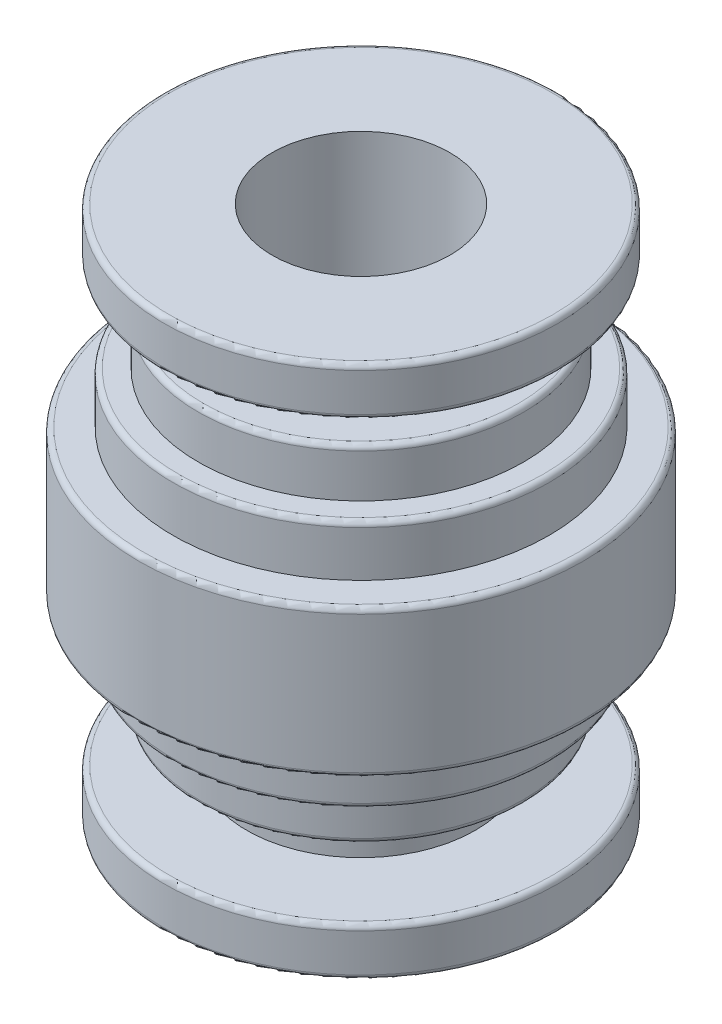
ISO-10303-21;
HEADER;
FILE_DESCRIPTION(('STEP AP214'),'2;1');
FILE_NAME('part.step','',(''),(''),'','','');
FILE_SCHEMA(('AUTOMOTIVE_DESIGN { 1 0 10303 214 1 1 1 1 }'));
ENDSEC;
DATA;
#1=APPLICATION_CONTEXT('core data for automotive mechanical design processes');
#2=APPLICATION_PROTOCOL_DEFINITION('international standard','automotive_design',2000,#1);
#3=PRODUCT_CONTEXT('',#1,'mechanical');
#4=PRODUCT('Part','Part','',(#3));
#5=PRODUCT_RELATED_PRODUCT_CATEGORY('part','',(#4));
#6=PRODUCT_DEFINITION_FORMATION('','',#4);
#7=PRODUCT_DEFINITION_CONTEXT('part definition',#1,'design');
#8=PRODUCT_DEFINITION('design','',#6,#7);
#9=PRODUCT_DEFINITION_SHAPE('','',#8);
#10=(LENGTH_UNIT() NAMED_UNIT(*) SI_UNIT(.MILLI.,.METRE.));
#11=(NAMED_UNIT(*) PLANE_ANGLE_UNIT() SI_UNIT($,.RADIAN.));
#12=(NAMED_UNIT(*) SI_UNIT($,.STERADIAN.) SOLID_ANGLE_UNIT());
#13=UNCERTAINTY_MEASURE_WITH_UNIT(LENGTH_MEASURE(1.E-05),#10,'distance_accuracy_value','');
#14=(GEOMETRIC_REPRESENTATION_CONTEXT(3) GLOBAL_UNCERTAINTY_ASSIGNED_CONTEXT((#13)) GLOBAL_UNIT_ASSIGNED_CONTEXT((#10,
#11,#12)) REPRESENTATION_CONTEXT('',''));
#15=CARTESIAN_POINT('',(0.,0.,0.));
#16=DIRECTION('',(0.,0.,1.));
#17=DIRECTION('',(1.,0.,0.));
#18=AXIS2_PLACEMENT_3D('',#15,#16,#17);
#19=CARTESIAN_POINT('',(0.,-10.3,0.));
#20=DIRECTION('',(0.,-1.,0.));
#21=DIRECTION('',(0.,0.,-1.));
#22=AXIS2_PLACEMENT_3D('',#19,#20,#21);
#23=TOROIDAL_SURFACE('',#22,7.55,0.2);
#24=CARTESIAN_POINT('',(0.,-10.3,0.));
#25=DIRECTION('',(0.,-1.,0.));
#26=DIRECTION('',(-1.,0.,0.));
#27=AXIS2_PLACEMENT_3D('',#24,#25,#26);
#28=CIRCLE('',#27,7.75);
#29=CARTESIAN_POINT('',(7.75,-10.3,0.));
#30=VERTEX_POINT('',#29);
#31=EDGE_CURVE('E10',#30,#30,#28,.T.);
#32=ORIENTED_EDGE('',*,*,#31,.T.);
#33=EDGE_LOOP('',(#32));
#34=FACE_BOUND('',#33,.T.);
#35=CARTESIAN_POINT('',(0.,-10.5,0.));
#36=DIRECTION('',(0.,1.,0.));
#37=DIRECTION('',(-1.,0.,0.));
#38=AXIS2_PLACEMENT_3D('',#35,#36,#37);
#39=CIRCLE('',#38,7.55);
#40=CARTESIAN_POINT('',(7.55,-10.5,0.));
#41=VERTEX_POINT('',#40);
#42=EDGE_CURVE('E27',#41,#41,#39,.T.);
#43=ORIENTED_EDGE('',*,*,#42,.T.);
#44=EDGE_LOOP('',(#43));
#45=FACE_BOUND('',#44,.T.);
#46=ADVANCED_FACE('F16',(#34,#45),#23,.T.);
#47=CARTESIAN_POINT('',(0.,-9.55,0.));
#48=DIRECTION('',(0.,-1.,0.));
#49=DIRECTION('',(1.,0.,0.));
#50=AXIS2_PLACEMENT_3D('',#47,#48,#49);
#51=CYLINDRICAL_SURFACE('',#50,7.75);
#52=CARTESIAN_POINT('',(0.,-8.8,0.));
#53=DIRECTION('',(0.,1.,0.));
#54=DIRECTION('',(-1.,0.,0.));
#55=AXIS2_PLACEMENT_3D('',#52,#53,#54);
#56=CIRCLE('',#55,7.75);
#57=CARTESIAN_POINT('',(7.75,-8.8,0.));
#58=VERTEX_POINT('',#57);
#59=EDGE_CURVE('E269',#58,#58,#56,.T.);
#60=ORIENTED_EDGE('',*,*,#59,.F.);
#61=EDGE_LOOP('',(#60));
#62=FACE_BOUND('',#61,.T.);
#63=ORIENTED_EDGE('',*,*,#31,.F.);
#64=EDGE_LOOP('',(#63));
#65=FACE_BOUND('',#64,.T.);
#66=ADVANCED_FACE('F321',(#62,#65),#51,.T.);
#67=CARTESIAN_POINT('',(7.75,-10.5,0.));
#68=DIRECTION('',(0.,1.,0.));
#69=DIRECTION('',(1.,0.,0.));
#70=AXIS2_PLACEMENT_3D('',#67,#68,#69);
#71=PLANE('',#70);
#72=ORIENTED_EDGE('',*,*,#42,.F.);
#73=EDGE_LOOP('',(#72));
#74=FACE_BOUND('',#73,.T.);
#75=CARTESIAN_POINT('',(0.,-10.5,0.));
#76=DIRECTION('',(0.,-1.,0.));
#77=DIRECTION('',(1.,0.,0.));
#78=AXIS2_PLACEMENT_3D('',#75,#76,#77);
#79=CIRCLE('',#78,3.5);
#80=CARTESIAN_POINT('',(3.5,-10.5,0.));
#81=VERTEX_POINT('',#80);
#82=EDGE_CURVE('E20',#81,#81,#79,.T.);
#83=ORIENTED_EDGE('',*,*,#82,.F.);
#84=EDGE_LOOP('',(#83));
#85=FACE_BOUND('',#84,.T.);
#86=ADVANCED_FACE('F188',(#74,#85),#71,.F.);
#87=CARTESIAN_POINT('',(0.,-8.8,0.));
#88=DIRECTION('',(0.,-1.,0.));
#89=DIRECTION('',(0.,0.,-1.));
#90=AXIS2_PLACEMENT_3D('',#87,#88,#89);
#91=TOROIDAL_SURFACE('',#90,7.55,0.2);
#92=CARTESIAN_POINT('',(0.,-8.6,0.));
#93=DIRECTION('',(0.,-1.,0.));
#94=DIRECTION('',(-1.,0.,0.));
#95=AXIS2_PLACEMENT_3D('',#92,#93,#94);
#96=CIRCLE('',#95,7.55);
#97=CARTESIAN_POINT('',(7.55,-8.6,0.));
#98=VERTEX_POINT('',#97);
#99=EDGE_CURVE('E229',#98,#98,#96,.T.);
#100=ORIENTED_EDGE('',*,*,#99,.T.);
#101=EDGE_LOOP('',(#100));
#102=FACE_BOUND('',#101,.T.);
#103=ORIENTED_EDGE('',*,*,#59,.T.);
#104=EDGE_LOOP('',(#103));
#105=FACE_BOUND('',#104,.T.);
#106=ADVANCED_FACE('F547',(#102,#105),#91,.T.);
#107=CARTESIAN_POINT('',(4.5,-8.6,0.));
#108=DIRECTION('',(0.,-1.,0.));
#109=DIRECTION('',(0.,0.,-1.));
#110=AXIS2_PLACEMENT_3D('',#107,#108,#109);
#111=PLANE('',#110);
#112=ORIENTED_EDGE('',*,*,#99,.F.);
#113=EDGE_LOOP('',(#112));
#114=FACE_BOUND('',#113,.T.);
#115=CARTESIAN_POINT('',(0.,-8.6,0.));
#116=DIRECTION('',(0.,-1.,0.));
#117=DIRECTION('',(1.,0.,0.));
#118=AXIS2_PLACEMENT_3D('',#115,#116,#117);
#119=CIRCLE('',#118,4.5);
#120=CARTESIAN_POINT('',(4.5,-8.6,0.));
#121=VERTEX_POINT('',#120);
#122=EDGE_CURVE('E249',#121,#121,#119,.T.);
#123=ORIENTED_EDGE('',*,*,#122,.T.);
#124=EDGE_LOOP('',(#123));
#125=FACE_BOUND('',#124,.T.);
#126=ADVANCED_FACE('F359',(#114,#125),#111,.F.);
#127=CARTESIAN_POINT('',(0.,-6.6,0.));
#128=DIRECTION('',(0.,-1.,0.));
#129=DIRECTION('',(0.,0.,-1.));
#130=AXIS2_PLACEMENT_3D('',#127,#128,#129);
#131=TOROIDAL_SURFACE('',#130,6.2,0.2);
#132=CARTESIAN_POINT('',(0.,-6.6,0.));
#133=DIRECTION('',(0.,-1.,0.));
#134=DIRECTION('',(-1.,0.,0.));
#135=AXIS2_PLACEMENT_3D('',#132,#133,#134);
#136=CIRCLE('',#135,6.4);
#137=CARTESIAN_POINT('',(6.4,-6.6,0.));
#138=VERTEX_POINT('',#137);
#139=EDGE_CURVE('E219',#138,#138,#136,.T.);
#140=ORIENTED_EDGE('',*,*,#139,.T.);
#141=EDGE_LOOP('',(#140));
#142=FACE_BOUND('',#141,.T.);
#143=CARTESIAN_POINT('',(0.,-6.8,0.));
#144=DIRECTION('',(0.,1.,0.));
#145=DIRECTION('',(-1.,0.,0.));
#146=AXIS2_PLACEMENT_3D('',#143,#144,#145);
#147=CIRCLE('',#146,6.2);
#148=CARTESIAN_POINT('',(6.2,-6.8,0.));
#149=VERTEX_POINT('',#148);
#150=EDGE_CURVE('E216',#149,#149,#147,.T.);
#151=ORIENTED_EDGE('',*,*,#150,.T.);
#152=EDGE_LOOP('',(#151));
#153=FACE_BOUND('',#152,.T.);
#154=ADVANCED_FACE('F355',(#142,#153),#131,.T.);
#155=CARTESIAN_POINT('',(6.4,-6.8,0.));
#156=DIRECTION('',(0.,1.,0.));
#157=DIRECTION('',(1.,0.,0.));
#158=AXIS2_PLACEMENT_3D('',#155,#156,#157);
#159=PLANE('',#158);
#160=ORIENTED_EDGE('',*,*,#150,.F.);
#161=EDGE_LOOP('',(#160));
#162=FACE_BOUND('',#161,.T.);
#163=CARTESIAN_POINT('',(0.,-6.8,0.));
#164=DIRECTION('',(0.,-1.,0.));
#165=DIRECTION('',(1.,0.,0.));
#166=AXIS2_PLACEMENT_3D('',#163,#164,#165);
#167=CIRCLE('',#166,4.5);
#168=CARTESIAN_POINT('',(4.5,-6.8,0.));
#169=VERTEX_POINT('',#168);
#170=EDGE_CURVE('E192',#169,#169,#167,.T.);
#171=ORIENTED_EDGE('',*,*,#170,.F.);
#172=EDGE_LOOP('',(#171));
#173=FACE_BOUND('',#172,.T.);
#174=ADVANCED_FACE('F358',(#162,#173),#159,.F.);
#175=CARTESIAN_POINT('',(0.,-5.85,0.));
#176=DIRECTION('',(0.,-1.,0.));
#177=DIRECTION('',(1.,0.,0.));
#178=AXIS2_PLACEMENT_3D('',#175,#176,#177);
#179=CYLINDRICAL_SURFACE('',#178,6.4);
#180=CARTESIAN_POINT('',(0.,-4.9,0.));
#181=DIRECTION('',(0.,-1.,0.));
#182=DIRECTION('',(1.,0.,0.));
#183=AXIS2_PLACEMENT_3D('',#180,#181,#182);
#184=CIRCLE('',#183,6.4);
#185=CARTESIAN_POINT('',(6.4,-4.9,0.));
#186=VERTEX_POINT('',#185);
#187=EDGE_CURVE('E149',#186,#186,#184,.T.);
#188=ORIENTED_EDGE('',*,*,#187,.T.);
#189=EDGE_LOOP('',(#188));
#190=FACE_BOUND('',#189,.T.);
#191=ORIENTED_EDGE('',*,*,#139,.F.);
#192=EDGE_LOOP('',(#191));
#193=FACE_BOUND('',#192,.T.);
#194=ADVANCED_FACE('F370',(#190,#193),#179,.T.);
#195=CARTESIAN_POINT('',(0.,-4.7,0.));
#196=DIRECTION('',(0.,-1.,0.));
#197=DIRECTION('',(0.,0.,-1.));
#198=AXIS2_PLACEMENT_3D('',#195,#196,#197);
#199=TOROIDAL_SURFACE('',#198,7.2,0.2);
#200=CARTESIAN_POINT('',(0.,-4.7,0.));
#201=DIRECTION('',(0.,-1.,0.));
#202=DIRECTION('',(-1.,0.,0.));
#203=AXIS2_PLACEMENT_3D('',#200,#201,#202);
#204=CIRCLE('',#203,7.4);
#205=CARTESIAN_POINT('',(7.4,-4.7,0.));
#206=VERTEX_POINT('',#205);
#207=EDGE_CURVE('E157',#206,#206,#204,.T.);
#208=ORIENTED_EDGE('',*,*,#207,.T.);
#209=EDGE_LOOP('',(#208));
#210=FACE_BOUND('',#209,.T.);
#211=CARTESIAN_POINT('',(0.,-4.9,0.));
#212=DIRECTION('',(0.,1.,0.));
#213=DIRECTION('',(-1.,0.,0.));
#214=AXIS2_PLACEMENT_3D('',#211,#212,#213);
#215=CIRCLE('',#214,7.2);
#216=CARTESIAN_POINT('',(7.2,-4.9,0.));
#217=VERTEX_POINT('',#216);
#218=EDGE_CURVE('E251',#217,#217,#215,.T.);
#219=ORIENTED_EDGE('',*,*,#218,.T.);
#220=EDGE_LOOP('',(#219));
#221=FACE_BOUND('',#220,.T.);
#222=ADVANCED_FACE('F365',(#210,#221),#199,.T.);
#223=CARTESIAN_POINT('',(7.4,-4.9,0.));
#224=DIRECTION('',(0.,1.,0.));
#225=DIRECTION('',(1.,0.,0.));
#226=AXIS2_PLACEMENT_3D('',#223,#224,#225);
#227=PLANE('',#226);
#228=ORIENTED_EDGE('',*,*,#218,.F.);
#229=EDGE_LOOP('',(#228));
#230=FACE_BOUND('',#229,.T.);
#231=ORIENTED_EDGE('',*,*,#187,.F.);
#232=EDGE_LOOP('',(#231));
#233=FACE_BOUND('',#232,.T.);
#234=ADVANCED_FACE('F361',(#230,#233),#227,.F.);
#235=CARTESIAN_POINT('',(0.,-3.9,0.));
#236=DIRECTION('',(0.,-1.,0.));
#237=DIRECTION('',(1.,0.,0.));
#238=AXIS2_PLACEMENT_3D('',#235,#236,#237);
#239=CYLINDRICAL_SURFACE('',#238,7.4);
#240=CARTESIAN_POINT('',(0.,-2.9,0.));
#241=DIRECTION('',(0.,-1.,0.));
#242=DIRECTION('',(1.,0.,0.));
#243=AXIS2_PLACEMENT_3D('',#240,#241,#242);
#244=CIRCLE('',#243,7.4);
#245=CARTESIAN_POINT('',(7.4,-2.9,0.));
#246=VERTEX_POINT('',#245);
#247=EDGE_CURVE('E255',#246,#246,#244,.T.);
#248=ORIENTED_EDGE('',*,*,#247,.T.);
#249=EDGE_LOOP('',(#248));
#250=FACE_BOUND('',#249,.T.);
#251=ORIENTED_EDGE('',*,*,#207,.F.);
#252=EDGE_LOOP('',(#251));
#253=FACE_BOUND('',#252,.T.);
#254=ADVANCED_FACE('F364',(#250,#253),#239,.T.);
#255=CARTESIAN_POINT('',(0.,-2.7,0.));
#256=DIRECTION('',(0.,-1.,0.));
#257=DIRECTION('',(0.,0.,-1.));
#258=AXIS2_PLACEMENT_3D('',#255,#256,#257);
#259=TOROIDAL_SURFACE('',#258,8.55,0.2);
#260=CARTESIAN_POINT('',(0.,-2.7,0.));
#261=DIRECTION('',(0.,-1.,0.));
#262=DIRECTION('',(-1.,0.,0.));
#263=AXIS2_PLACEMENT_3D('',#260,#261,#262);
#264=CIRCLE('',#263,8.75);
#265=CARTESIAN_POINT('',(8.75,-2.7,0.));
#266=VERTEX_POINT('',#265);
#267=EDGE_CURVE('E277',#266,#266,#264,.T.);
#268=ORIENTED_EDGE('',*,*,#267,.T.);
#269=EDGE_LOOP('',(#268));
#270=FACE_BOUND('',#269,.T.);
#271=CARTESIAN_POINT('',(0.,-2.9,0.));
#272=DIRECTION('',(0.,1.,0.));
#273=DIRECTION('',(-1.,0.,0.));
#274=AXIS2_PLACEMENT_3D('',#271,#272,#273);
#275=CIRCLE('',#274,8.55);
#276=CARTESIAN_POINT('',(8.55,-2.9,0.));
#277=VERTEX_POINT('',#276);
#278=EDGE_CURVE('E214',#277,#277,#275,.T.);
#279=ORIENTED_EDGE('',*,*,#278,.T.);
#280=EDGE_LOOP('',(#279));
#281=FACE_BOUND('',#280,.T.);
#282=ADVANCED_FACE('F528',(#270,#281),#259,.T.);
#283=CARTESIAN_POINT('',(0.,1.45,0.));
#284=DIRECTION('',(0.,-1.,0.));
#285=DIRECTION('',(1.,0.,0.));
#286=AXIS2_PLACEMENT_3D('',#283,#284,#285);
#287=CYLINDRICAL_SURFACE('',#286,8.75);
#288=CARTESIAN_POINT('',(0.,2.7,0.));
#289=DIRECTION('',(0.,1.,0.));
#290=DIRECTION('',(-1.,0.,0.));
#291=AXIS2_PLACEMENT_3D('',#288,#289,#290);
#292=CIRCLE('',#291,8.75);
#293=CARTESIAN_POINT('',(8.75,2.7,0.));
#294=VERTEX_POINT('',#293);
#295=EDGE_CURVE('E137',#294,#294,#292,.T.);
#296=ORIENTED_EDGE('',*,*,#295,.F.);
#297=EDGE_LOOP('',(#296));
#298=FACE_BOUND('',#297,.T.);
#299=ORIENTED_EDGE('',*,*,#267,.F.);
#300=EDGE_LOOP('',(#299));
#301=FACE_BOUND('',#300,.T.);
#302=ADVANCED_FACE('F526',(#298,#301),#287,.T.);
#303=CARTESIAN_POINT('',(8.75,-2.9,0.));
#304=DIRECTION('',(0.,1.,0.));
#305=DIRECTION('',(1.,0.,0.));
#306=AXIS2_PLACEMENT_3D('',#303,#304,#305);
#307=PLANE('',#306);
#308=ORIENTED_EDGE('',*,*,#278,.F.);
#309=EDGE_LOOP('',(#308));
#310=FACE_BOUND('',#309,.T.);
#311=ORIENTED_EDGE('',*,*,#247,.F.);
#312=EDGE_LOOP('',(#311));
#313=FACE_BOUND('',#312,.T.);
#314=ADVANCED_FACE('F415',(#310,#313),#307,.F.);
#315=CARTESIAN_POINT('',(0.,10.3,0.));
#316=DIRECTION('',(0.,-1.,0.));
#317=DIRECTION('',(0.,0.,-1.));
#318=AXIS2_PLACEMENT_3D('',#315,#316,#317);
#319=TOROIDAL_SURFACE('',#318,7.55,0.2);
#320=CARTESIAN_POINT('',(0.,10.5,0.));
#321=DIRECTION('',(0.,-1.,0.));
#322=DIRECTION('',(-1.,0.,0.));
#323=AXIS2_PLACEMENT_3D('',#320,#321,#322);
#324=CIRCLE('',#323,7.55);
#325=CARTESIAN_POINT('',(7.55,10.5,0.));
#326=VERTEX_POINT('',#325);
#327=EDGE_CURVE('E128',#326,#326,#324,.T.);
#328=ORIENTED_EDGE('',*,*,#327,.T.);
#329=EDGE_LOOP('',(#328));
#330=FACE_BOUND('',#329,.T.);
#331=CARTESIAN_POINT('',(0.,10.3,0.));
#332=DIRECTION('',(0.,1.,0.));
#333=DIRECTION('',(-1.,0.,0.));
#334=AXIS2_PLACEMENT_3D('',#331,#332,#333);
#335=CIRCLE('',#334,7.75);
#336=CARTESIAN_POINT('',(7.75,10.3,0.));
#337=VERTEX_POINT('',#336);
#338=EDGE_CURVE('E215',#337,#337,#335,.T.);
#339=ORIENTED_EDGE('',*,*,#338,.T.);
#340=EDGE_LOOP('',(#339));
#341=FACE_BOUND('',#340,.T.);
#342=ADVANCED_FACE('F408',(#330,#341),#319,.T.);
#343=CARTESIAN_POINT('',(0.,9.55,0.));
#344=DIRECTION('',(0.,-1.,0.));
#345=DIRECTION('',(1.,0.,0.));
#346=AXIS2_PLACEMENT_3D('',#343,#344,#345);
#347=CYLINDRICAL_SURFACE('',#346,7.75);
#348=CARTESIAN_POINT('',(0.,8.8,0.));
#349=DIRECTION('',(0.,-1.,0.));
#350=DIRECTION('',(-1.,0.,0.));
#351=AXIS2_PLACEMENT_3D('',#348,#349,#350);
#352=CIRCLE('',#351,7.75);
#353=CARTESIAN_POINT('',(7.75,8.8,0.));
#354=VERTEX_POINT('',#353);
#355=EDGE_CURVE('E262',#354,#354,#352,.T.);
#356=ORIENTED_EDGE('',*,*,#355,.F.);
#357=EDGE_LOOP('',(#356));
#358=FACE_BOUND('',#357,.T.);
#359=ORIENTED_EDGE('',*,*,#338,.F.);
#360=EDGE_LOOP('',(#359));
#361=FACE_BOUND('',#360,.T.);
#362=ADVANCED_FACE('F332',(#358,#361),#347,.T.);
#363=CARTESIAN_POINT('',(7.75,10.5,0.));
#364=DIRECTION('',(0.,1.,0.));
#365=DIRECTION('',(1.,0.,0.));
#366=AXIS2_PLACEMENT_3D('',#363,#364,#365);
#367=PLANE('',#366);
#368=ORIENTED_EDGE('',*,*,#327,.F.);
#369=EDGE_LOOP('',(#368));
#370=FACE_BOUND('',#369,.T.);
#371=CARTESIAN_POINT('',(0.,10.5,0.));
#372=DIRECTION('',(0.,-1.,0.));
#373=DIRECTION('',(1.,0.,0.));
#374=AXIS2_PLACEMENT_3D('',#371,#372,#373);
#375=CIRCLE('',#374,3.5);
#376=CARTESIAN_POINT('',(3.5,10.5,0.));
#377=VERTEX_POINT('',#376);
#378=EDGE_CURVE('E258',#377,#377,#375,.T.);
#379=ORIENTED_EDGE('',*,*,#378,.T.);
#380=EDGE_LOOP('',(#379));
#381=FACE_BOUND('',#380,.T.);
#382=ADVANCED_FACE('F367',(#370,#381),#367,.T.);
#383=CARTESIAN_POINT('',(0.,8.8,0.));
#384=DIRECTION('',(0.,-1.,0.));
#385=DIRECTION('',(0.,0.,-1.));
#386=AXIS2_PLACEMENT_3D('',#383,#384,#385);
#387=TOROIDAL_SURFACE('',#386,7.55,0.2);
#388=ORIENTED_EDGE('',*,*,#355,.T.);
#389=EDGE_LOOP('',(#388));
#390=FACE_BOUND('',#389,.T.);
#391=CARTESIAN_POINT('',(0.,8.6,0.));
#392=DIRECTION('',(0.,1.,0.));
#393=DIRECTION('',(-1.,0.,0.));
#394=AXIS2_PLACEMENT_3D('',#391,#392,#393);
#395=CIRCLE('',#394,7.55);
#396=CARTESIAN_POINT('',(7.55,8.6,0.));
#397=VERTEX_POINT('',#396);
#398=EDGE_CURVE('E210',#397,#397,#395,.T.);
#399=ORIENTED_EDGE('',*,*,#398,.T.);
#400=EDGE_LOOP('',(#399));
#401=FACE_BOUND('',#400,.T.);
#402=ADVANCED_FACE('F369',(#390,#401),#387,.T.);
#403=CARTESIAN_POINT('',(4.5,8.6,0.));
#404=DIRECTION('',(0.,-1.,0.));
#405=DIRECTION('',(0.,0.,-1.));
#406=AXIS2_PLACEMENT_3D('',#403,#404,#405);
#407=PLANE('',#406);
#408=ORIENTED_EDGE('',*,*,#398,.F.);
#409=EDGE_LOOP('',(#408));
#410=FACE_BOUND('',#409,.T.);
#411=CARTESIAN_POINT('',(0.,8.6,0.));
#412=DIRECTION('',(0.,-1.,0.));
#413=DIRECTION('',(1.,0.,0.));
#414=AXIS2_PLACEMENT_3D('',#411,#412,#413);
#415=CIRCLE('',#414,4.5);
#416=CARTESIAN_POINT('',(4.5,8.6,0.));
#417=VERTEX_POINT('',#416);
#418=EDGE_CURVE('E265',#417,#417,#415,.T.);
#419=ORIENTED_EDGE('',*,*,#418,.F.);
#420=EDGE_LOOP('',(#419));
#421=FACE_BOUND('',#420,.T.);
#422=ADVANCED_FACE('F421',(#410,#421),#407,.T.);
#423=CARTESIAN_POINT('',(0.,6.6,0.));
#424=DIRECTION('',(0.,-1.,0.));
#425=DIRECTION('',(0.,0.,-1.));
#426=AXIS2_PLACEMENT_3D('',#423,#424,#425);
#427=TOROIDAL_SURFACE('',#426,6.2,0.2);
#428=CARTESIAN_POINT('',(0.,6.8,0.));
#429=DIRECTION('',(0.,-1.,0.));
#430=DIRECTION('',(-1.,0.,0.));
#431=AXIS2_PLACEMENT_3D('',#428,#429,#430);
#432=CIRCLE('',#431,6.2);
#433=CARTESIAN_POINT('',(6.2,6.8,0.));
#434=VERTEX_POINT('',#433);
#435=EDGE_CURVE('E270',#434,#434,#432,.T.);
#436=ORIENTED_EDGE('',*,*,#435,.T.);
#437=EDGE_LOOP('',(#436));
#438=FACE_BOUND('',#437,.T.);
#439=CARTESIAN_POINT('',(0.,6.6,0.));
#440=DIRECTION('',(0.,1.,0.));
#441=DIRECTION('',(-1.,0.,0.));
#442=AXIS2_PLACEMENT_3D('',#439,#440,#441);
#443=CIRCLE('',#442,6.4);
#444=CARTESIAN_POINT('',(6.4,6.6,0.));
#445=VERTEX_POINT('',#444);
#446=EDGE_CURVE('E240',#445,#445,#443,.T.);
#447=ORIENTED_EDGE('',*,*,#446,.T.);
#448=EDGE_LOOP('',(#447));
#449=FACE_BOUND('',#448,.T.);
#450=ADVANCED_FACE('F18',(#438,#449),#427,.T.);
#451=CARTESIAN_POINT('',(6.4,6.8,0.));
#452=DIRECTION('',(0.,1.,0.));
#453=DIRECTION('',(1.,0.,0.));
#454=AXIS2_PLACEMENT_3D('',#451,#452,#453);
#455=PLANE('',#454);
#456=ORIENTED_EDGE('',*,*,#435,.F.);
#457=EDGE_LOOP('',(#456));
#458=FACE_BOUND('',#457,.T.);
#459=CARTESIAN_POINT('',(0.,6.8,0.));
#460=DIRECTION('',(0.,-1.,0.));
#461=DIRECTION('',(1.,0.,0.));
#462=AXIS2_PLACEMENT_3D('',#459,#460,#461);
#463=CIRCLE('',#462,4.5);
#464=CARTESIAN_POINT('',(4.5,6.8,0.));
#465=VERTEX_POINT('',#464);
#466=EDGE_CURVE('E233',#465,#465,#463,.T.);
#467=ORIENTED_EDGE('',*,*,#466,.T.);
#468=EDGE_LOOP('',(#467));
#469=FACE_BOUND('',#468,.T.);
#470=ADVANCED_FACE('F339',(#458,#469),#455,.T.);
#471=CARTESIAN_POINT('',(0.,5.85,0.));
#472=DIRECTION('',(0.,-1.,0.));
#473=DIRECTION('',(1.,0.,0.));
#474=AXIS2_PLACEMENT_3D('',#471,#472,#473);
#475=CYLINDRICAL_SURFACE('',#474,6.4);
#476=CARTESIAN_POINT('',(0.,4.9,0.));
#477=DIRECTION('',(0.,-1.,0.));
#478=DIRECTION('',(1.,0.,0.));
#479=AXIS2_PLACEMENT_3D('',#476,#477,#478);
#480=CIRCLE('',#479,6.4);
#481=CARTESIAN_POINT('',(6.4,4.9,0.));
#482=VERTEX_POINT('',#481);
#483=EDGE_CURVE('E221',#482,#482,#480,.T.);
#484=ORIENTED_EDGE('',*,*,#483,.F.);
#485=EDGE_LOOP('',(#484));
#486=FACE_BOUND('',#485,.T.);
#487=ORIENTED_EDGE('',*,*,#446,.F.);
#488=EDGE_LOOP('',(#487));
#489=FACE_BOUND('',#488,.T.);
#490=ADVANCED_FACE('F341',(#486,#489),#475,.T.);
#491=CARTESIAN_POINT('',(0.,4.7,0.));
#492=DIRECTION('',(0.,-1.,0.));
#493=DIRECTION('',(0.,0.,-1.));
#494=AXIS2_PLACEMENT_3D('',#491,#492,#493);
#495=TOROIDAL_SURFACE('',#494,7.2,0.2);
#496=CARTESIAN_POINT('',(0.,4.9,0.));
#497=DIRECTION('',(0.,-1.,0.));
#498=DIRECTION('',(-1.,0.,0.));
#499=AXIS2_PLACEMENT_3D('',#496,#497,#498);
#500=CIRCLE('',#499,7.2);
#501=CARTESIAN_POINT('',(7.2,4.9,0.));
#502=VERTEX_POINT('',#501);
#503=EDGE_CURVE('E230',#502,#502,#500,.T.);
#504=ORIENTED_EDGE('',*,*,#503,.T.);
#505=EDGE_LOOP('',(#504));
#506=FACE_BOUND('',#505,.T.);
#507=CARTESIAN_POINT('',(0.,4.7,0.));
#508=DIRECTION('',(0.,1.,0.));
#509=DIRECTION('',(-1.,0.,0.));
#510=AXIS2_PLACEMENT_3D('',#507,#508,#509);
#511=CIRCLE('',#510,7.4);
#512=CARTESIAN_POINT('',(7.4,4.7,0.));
#513=VERTEX_POINT('',#512);
#514=EDGE_CURVE('E225',#513,#513,#511,.T.);
#515=ORIENTED_EDGE('',*,*,#514,.T.);
#516=EDGE_LOOP('',(#515));
#517=FACE_BOUND('',#516,.T.);
#518=ADVANCED_FACE('F315',(#506,#517),#495,.T.);
#519=CARTESIAN_POINT('',(7.4,4.9,0.));
#520=DIRECTION('',(0.,1.,0.));
#521=DIRECTION('',(1.,0.,0.));
#522=AXIS2_PLACEMENT_3D('',#519,#520,#521);
#523=PLANE('',#522);
#524=ORIENTED_EDGE('',*,*,#503,.F.);
#525=EDGE_LOOP('',(#524));
#526=FACE_BOUND('',#525,.T.);
#527=ORIENTED_EDGE('',*,*,#483,.T.);
#528=EDGE_LOOP('',(#527));
#529=FACE_BOUND('',#528,.T.);
#530=ADVANCED_FACE('F307',(#526,#529),#523,.T.);
#531=CARTESIAN_POINT('',(0.,3.9,0.));
#532=DIRECTION('',(0.,-1.,0.));
#533=DIRECTION('',(1.,0.,0.));
#534=AXIS2_PLACEMENT_3D('',#531,#532,#533);
#535=CYLINDRICAL_SURFACE('',#534,7.4);
#536=CARTESIAN_POINT('',(0.,2.9,0.));
#537=DIRECTION('',(0.,-1.,0.));
#538=DIRECTION('',(1.,0.,0.));
#539=AXIS2_PLACEMENT_3D('',#536,#537,#538);
#540=CIRCLE('',#539,7.4);
#541=CARTESIAN_POINT('',(7.4,2.9,0.));
#542=VERTEX_POINT('',#541);
#543=EDGE_CURVE('E191',#542,#542,#540,.T.);
#544=ORIENTED_EDGE('',*,*,#543,.F.);
#545=EDGE_LOOP('',(#544));
#546=FACE_BOUND('',#545,.T.);
#547=ORIENTED_EDGE('',*,*,#514,.F.);
#548=EDGE_LOOP('',(#547));
#549=FACE_BOUND('',#548,.T.);
#550=ADVANCED_FACE('F304',(#546,#549),#535,.T.);
#551=CARTESIAN_POINT('',(0.,2.7,0.));
#552=DIRECTION('',(0.,-1.,0.));
#553=DIRECTION('',(0.,0.,-1.));
#554=AXIS2_PLACEMENT_3D('',#551,#552,#553);
#555=TOROIDAL_SURFACE('',#554,8.55,0.2);
#556=CARTESIAN_POINT('',(0.,2.9,0.));
#557=DIRECTION('',(0.,-1.,0.));
#558=DIRECTION('',(-1.,0.,0.));
#559=AXIS2_PLACEMENT_3D('',#556,#557,#558);
#560=CIRCLE('',#559,8.55);
#561=CARTESIAN_POINT('',(8.55,2.9,0.));
#562=VERTEX_POINT('',#561);
#563=EDGE_CURVE('E226',#562,#562,#560,.T.);
#564=ORIENTED_EDGE('',*,*,#563,.T.);
#565=EDGE_LOOP('',(#564));
#566=FACE_BOUND('',#565,.T.);
#567=ORIENTED_EDGE('',*,*,#295,.T.);
#568=EDGE_LOOP('',(#567));
#569=FACE_BOUND('',#568,.T.);
#570=ADVANCED_FACE('F295',(#566,#569),#555,.T.);
#571=CARTESIAN_POINT('',(8.75,2.9,0.));
#572=DIRECTION('',(0.,1.,0.));
#573=DIRECTION('',(1.,0.,0.));
#574=AXIS2_PLACEMENT_3D('',#571,#572,#573);
#575=PLANE('',#574);
#576=ORIENTED_EDGE('',*,*,#563,.F.);
#577=EDGE_LOOP('',(#576));
#578=FACE_BOUND('',#577,.T.);
#579=ORIENTED_EDGE('',*,*,#543,.T.);
#580=EDGE_LOOP('',(#579));
#581=FACE_BOUND('',#580,.T.);
#582=ADVANCED_FACE('F298',(#578,#581),#575,.T.);
#583=CARTESIAN_POINT('',(0.,-7.5,0.));
#584=DIRECTION('',(0.,-1.,0.));
#585=DIRECTION('',(1.,0.,0.));
#586=AXIS2_PLACEMENT_3D('',#583,#584,#585);
#587=CYLINDRICAL_SURFACE('',#586,3.5);
#588=CARTESIAN_POINT('',(0.,-4.5,0.));
#589=DIRECTION('',(0.,-1.,0.));
#590=DIRECTION('',(1.,0.,0.));
#591=AXIS2_PLACEMENT_3D('',#588,#589,#590);
#592=CIRCLE('',#591,3.5);
#593=CARTESIAN_POINT('',(3.5,-4.5,0.));
#594=VERTEX_POINT('',#593);
#595=EDGE_CURVE('E201',#594,#594,#592,.T.);
#596=ORIENTED_EDGE('',*,*,#595,.F.);
#597=EDGE_LOOP('',(#596));
#598=FACE_BOUND('',#597,.T.);
#599=ORIENTED_EDGE('',*,*,#82,.T.);
#600=EDGE_LOOP('',(#599));
#601=FACE_BOUND('',#600,.T.);
#602=ADVANCED_FACE('F301',(#598,#601),#587,.F.);
#603=CARTESIAN_POINT('',(0.,-7.7,0.));
#604=DIRECTION('',(0.,-1.,0.));
#605=DIRECTION('',(1.,0.,0.));
#606=AXIS2_PLACEMENT_3D('',#603,#604,#605);
#607=CYLINDRICAL_SURFACE('',#606,4.5);
#608=ORIENTED_EDGE('',*,*,#122,.F.);
#609=EDGE_LOOP('',(#608));
#610=FACE_BOUND('',#609,.T.);
#611=ORIENTED_EDGE('',*,*,#170,.T.);
#612=EDGE_LOOP('',(#611));
#613=FACE_BOUND('',#612,.T.);
#614=ADVANCED_FACE('F517',(#610,#613),#607,.T.);
#615=CARTESIAN_POINT('',(3.5,-4.5,0.));
#616=DIRECTION('',(0.,-1.,0.));
#617=DIRECTION('',(0.,0.,-1.));
#618=AXIS2_PLACEMENT_3D('',#615,#616,#617);
#619=PLANE('',#618);
#620=CARTESIAN_POINT('',(0.,-4.5,0.));
#621=DIRECTION('',(0.,-1.,0.));
#622=DIRECTION('',(1.,0.,0.));
#623=AXIS2_PLACEMENT_3D('',#620,#621,#622);
#624=CIRCLE('',#623,5.);
#625=CARTESIAN_POINT('',(5.,-4.5,0.));
#626=VERTEX_POINT('',#625);
#627=EDGE_CURVE('E391',#626,#626,#624,.T.);
#628=ORIENTED_EDGE('',*,*,#627,.F.);
#629=EDGE_LOOP('',(#628));
#630=FACE_BOUND('',#629,.T.);
#631=ORIENTED_EDGE('',*,*,#595,.T.);
#632=EDGE_LOOP('',(#631));
#633=FACE_BOUND('',#632,.T.);
#634=ADVANCED_FACE('F513',(#630,#633),#619,.F.);
#635=CARTESIAN_POINT('',(0.,7.5,0.));
#636=DIRECTION('',(0.,-1.,0.));
#637=DIRECTION('',(1.,0.,0.));
#638=AXIS2_PLACEMENT_3D('',#635,#636,#637);
#639=CYLINDRICAL_SURFACE('',#638,3.5);
#640=CARTESIAN_POINT('',(0.,4.5,0.));
#641=DIRECTION('',(0.,-1.,0.));
#642=DIRECTION('',(1.,0.,0.));
#643=AXIS2_PLACEMENT_3D('',#640,#641,#642);
#644=CIRCLE('',#643,3.5);
#645=CARTESIAN_POINT('',(3.5,4.5,0.));
#646=VERTEX_POINT('',#645);
#647=EDGE_CURVE('E167',#646,#646,#644,.T.);
#648=ORIENTED_EDGE('',*,*,#647,.T.);
#649=EDGE_LOOP('',(#648));
#650=FACE_BOUND('',#649,.T.);
#651=ORIENTED_EDGE('',*,*,#378,.F.);
#652=EDGE_LOOP('',(#651));
#653=FACE_BOUND('',#652,.T.);
#654=ADVANCED_FACE('F516',(#650,#653),#639,.F.);
#655=CARTESIAN_POINT('',(0.,7.7,0.));
#656=DIRECTION('',(0.,-1.,0.));
#657=DIRECTION('',(1.,0.,0.));
#658=AXIS2_PLACEMENT_3D('',#655,#656,#657);
#659=CYLINDRICAL_SURFACE('',#658,4.5);
#660=ORIENTED_EDGE('',*,*,#418,.T.);
#661=EDGE_LOOP('',(#660));
#662=FACE_BOUND('',#661,.T.);
#663=ORIENTED_EDGE('',*,*,#466,.F.);
#664=EDGE_LOOP('',(#663));
#665=FACE_BOUND('',#664,.T.);
#666=ADVANCED_FACE('F554',(#662,#665),#659,.T.);
#667=CARTESIAN_POINT('',(0.,2.25,0.));
#668=DIRECTION('',(0.,-1.,0.));
#669=DIRECTION('',(1.,0.,0.));
#670=AXIS2_PLACEMENT_3D('',#667,#668,#669);
#671=CYLINDRICAL_SURFACE('',#670,5.);
#672=ORIENTED_EDGE('',*,*,#627,.T.);
#673=EDGE_LOOP('',(#672));
#674=FACE_BOUND('',#673,.T.);
#675=CARTESIAN_POINT('',(0.,4.5,0.));
#676=DIRECTION('',(0.,-1.,0.));
#677=DIRECTION('',(1.,0.,0.));
#678=AXIS2_PLACEMENT_3D('',#675,#676,#677);
#679=CIRCLE('',#678,5.);
#680=CARTESIAN_POINT('',(5.,4.5,0.));
#681=VERTEX_POINT('',#680);
#682=EDGE_CURVE('E176',#681,#681,#679,.T.);
#683=ORIENTED_EDGE('',*,*,#682,.F.);
#684=EDGE_LOOP('',(#683));
#685=FACE_BOUND('',#684,.T.);
#686=ADVANCED_FACE('F337',(#674,#685),#671,.F.);
#687=CARTESIAN_POINT('',(3.5,4.5,0.));
#688=DIRECTION('',(0.,-1.,0.));
#689=DIRECTION('',(0.,0.,-1.));
#690=AXIS2_PLACEMENT_3D('',#687,#688,#689);
#691=PLANE('',#690);
#692=ORIENTED_EDGE('',*,*,#682,.T.);
#693=EDGE_LOOP('',(#692));
#694=FACE_BOUND('',#693,.T.);
#695=ORIENTED_EDGE('',*,*,#647,.F.);
#696=EDGE_LOOP('',(#695));
#697=FACE_BOUND('',#696,.T.);
#698=ADVANCED_FACE('F334',(#694,#697),#691,.T.);
#699=CLOSED_SHELL('',(#46,#66,#86,#106,#126,#154,#174,#194,#222,#234,#254,#282,#302,#314,#342,
#362,#382,#402,#422,#450,#470,#490,#518,#530,#550,#570,#582,#602,#614,#634,#654,#666,#686,#698));
#700=MANIFOLD_SOLID_BREP('B1',#699);
#701=ADVANCED_BREP_SHAPE_REPRESENTATION('',(#18,#700),#14);
#702=SHAPE_DEFINITION_REPRESENTATION(#9,#701);
ENDSEC;
END-ISO-10303-21;
